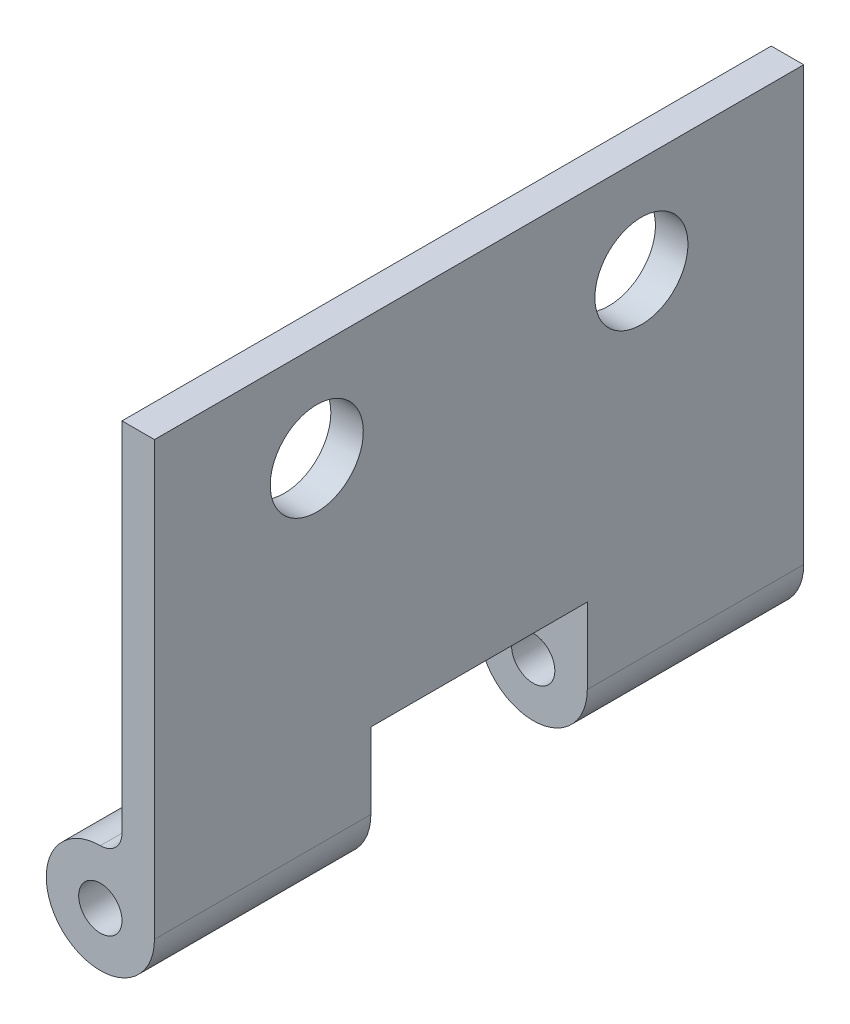
ISO-10303-21;
HEADER;
FILE_DESCRIPTION(('STEP AP214'),'2;1');
FILE_NAME('part.step','',(''),(''),'','','');
FILE_SCHEMA(('AUTOMOTIVE_DESIGN { 1 0 10303 214 1 1 1 1 }'));
ENDSEC;
DATA;
#1=APPLICATION_CONTEXT('core data for automotive mechanical design processes');
#2=APPLICATION_PROTOCOL_DEFINITION('international standard','automotive_design',2000,#1);
#3=PRODUCT_CONTEXT('',#1,'mechanical');
#4=PRODUCT('Part','Part','',(#3));
#5=PRODUCT_RELATED_PRODUCT_CATEGORY('part','',(#4));
#6=PRODUCT_DEFINITION_FORMATION('','',#4);
#7=PRODUCT_DEFINITION_CONTEXT('part definition',#1,'design');
#8=PRODUCT_DEFINITION('design','',#6,#7);
#9=PRODUCT_DEFINITION_SHAPE('','',#8);
#10=(LENGTH_UNIT() NAMED_UNIT(*) SI_UNIT(.MILLI.,.METRE.));
#11=(NAMED_UNIT(*) PLANE_ANGLE_UNIT() SI_UNIT($,.RADIAN.));
#12=(NAMED_UNIT(*) SI_UNIT($,.STERADIAN.) SOLID_ANGLE_UNIT());
#13=UNCERTAINTY_MEASURE_WITH_UNIT(LENGTH_MEASURE(1.E-05),#10,'distance_accuracy_value','');
#14=(GEOMETRIC_REPRESENTATION_CONTEXT(3) GLOBAL_UNCERTAINTY_ASSIGNED_CONTEXT((#13)) GLOBAL_UNIT_ASSIGNED_CONTEXT((#10,
#11,#12)) REPRESENTATION_CONTEXT('',''));
#15=CARTESIAN_POINT('',(0.,0.,0.));
#16=DIRECTION('',(0.,0.,1.));
#17=DIRECTION('',(1.,0.,0.));
#18=AXIS2_PLACEMENT_3D('',#15,#16,#17);
#19=CARTESIAN_POINT('',(0.,3.5,30.));
#20=DIRECTION('',(0.,0.,-1.));
#21=DIRECTION('',(-1.,0.,0.));
#22=AXIS2_PLACEMENT_3D('',#19,#20,#21);
#23=CYLINDRICAL_SURFACE('',#22,1.);
#24=DIRECTION('',(0.,0.,-1.));
#25=VECTOR('',#24,1.);
#26=CARTESIAN_POINT('',(0.999999999999999,3.5,30.));
#27=LINE('',#26,#25);
#28=CARTESIAN_POINT('',(0.999999999999999,3.5,30.));
#29=VERTEX_POINT('',#28);
#30=CARTESIAN_POINT('',(0.999999999999999,3.5,20.));
#31=VERTEX_POINT('',#30);
#32=EDGE_CURVE('E140',#29,#31,#27,.T.);
#33=ORIENTED_EDGE('',*,*,#32,.T.);
#34=CARTESIAN_POINT('',(0.,3.5,20.));
#35=DIRECTION('',(0.,0.,1.));
#36=DIRECTION('',(1.,0.,0.));
#37=AXIS2_PLACEMENT_3D('',#34,#35,#36);
#38=CIRCLE('',#37,1.);
#39=CARTESIAN_POINT('',(0.,2.5,20.));
#40=VERTEX_POINT('',#39);
#41=EDGE_CURVE('E158',#31,#40,#38,.F.);
#42=ORIENTED_EDGE('',*,*,#41,.T.);
#43=DIRECTION('',(0.,0.,-1.));
#44=VECTOR('',#43,1.);
#45=CARTESIAN_POINT('',(0.,2.5,30.));
#46=LINE('',#45,#44);
#47=CARTESIAN_POINT('',(0.,2.5,30.));
#48=VERTEX_POINT('',#47);
#49=EDGE_CURVE('E11',#48,#40,#46,.T.);
#50=ORIENTED_EDGE('',*,*,#49,.F.);
#51=CARTESIAN_POINT('',(0.,3.5,30.));
#52=DIRECTION('',(0.,0.,-1.));
#53=DIRECTION('',(-1.,0.,0.));
#54=AXIS2_PLACEMENT_3D('',#51,#52,#53);
#55=CIRCLE('',#54,1.);
#56=EDGE_CURVE('E139',#29,#48,#55,.T.);
#57=ORIENTED_EDGE('',*,*,#56,.F.);
#58=EDGE_LOOP('',(#33,#42,#50,#57));
#59=FACE_BOUND('',#58,.T.);
#60=ADVANCED_FACE('F37',(#59),#23,.F.);
#61=CARTESIAN_POINT('',(0.,0.,30.));
#62=DIRECTION('',(0.,0.,-1.));
#63=DIRECTION('',(-1.,0.,0.));
#64=AXIS2_PLACEMENT_3D('',#61,#62,#63);
#65=CYLINDRICAL_SURFACE('',#64,2.5);
#66=ORIENTED_EDGE('',*,*,#49,.T.);
#67=CARTESIAN_POINT('',(0.,0.,20.));
#68=DIRECTION('',(0.,0.,1.));
#69=DIRECTION('',(1.,0.,0.));
#70=AXIS2_PLACEMENT_3D('',#67,#68,#69);
#71=CIRCLE('',#70,2.5);
#72=CARTESIAN_POINT('',(2.5,0.,20.));
#73=VERTEX_POINT('',#72);
#74=EDGE_CURVE('E154',#40,#73,#71,.T.);
#75=ORIENTED_EDGE('',*,*,#74,.T.);
#76=DIRECTION('',(0.,0.,-1.));
#77=VECTOR('',#76,1.);
#78=CARTESIAN_POINT('',(2.5,0.,30.));
#79=LINE('',#78,#77);
#80=CARTESIAN_POINT('',(2.5,0.,30.));
#81=VERTEX_POINT('',#80);
#82=EDGE_CURVE('E145',#81,#73,#79,.T.);
#83=ORIENTED_EDGE('',*,*,#82,.F.);
#84=CARTESIAN_POINT('',(0.,0.,30.));
#85=DIRECTION('',(0.,0.,1.));
#86=DIRECTION('',(1.,0.,0.));
#87=AXIS2_PLACEMENT_3D('',#84,#85,#86);
#88=CIRCLE('',#87,2.5);
#89=EDGE_CURVE('E96',#48,#81,#88,.T.);
#90=ORIENTED_EDGE('',*,*,#89,.F.);
#91=EDGE_LOOP('',(#66,#75,#83,#90));
#92=FACE_BOUND('',#91,.T.);
#93=ADVANCED_FACE('F176',(#92),#65,.T.);
#94=CARTESIAN_POINT('',(0.,0.,30.));
#95=DIRECTION('',(0.,0.,-1.));
#96=DIRECTION('',(-1.,0.,0.));
#97=AXIS2_PLACEMENT_3D('',#94,#95,#96);
#98=CYLINDRICAL_SURFACE('',#97,0.999999999999999);
#99=CARTESIAN_POINT('',(0.,0.,20.));
#100=DIRECTION('',(0.,0.,1.));
#101=DIRECTION('',(1.,0.,0.));
#102=AXIS2_PLACEMENT_3D('',#99,#100,#101);
#103=CIRCLE('',#102,0.999999999999999);
#104=CARTESIAN_POINT('',(0.999999999999999,0.,20.));
#105=VERTEX_POINT('',#104);
#106=EDGE_CURVE('E152',#105,#105,#103,.T.);
#107=ORIENTED_EDGE('',*,*,#106,.F.);
#108=EDGE_LOOP('',(#107));
#109=FACE_BOUND('',#108,.T.);
#110=CARTESIAN_POINT('',(0.,0.,30.));
#111=DIRECTION('',(0.,0.,1.));
#112=DIRECTION('',(1.,0.,0.));
#113=AXIS2_PLACEMENT_3D('',#110,#111,#112);
#114=CIRCLE('',#113,0.999999999999999);
#115=CARTESIAN_POINT('',(0.999999999999999,0.,30.));
#116=VERTEX_POINT('',#115);
#117=EDGE_CURVE('E131',#116,#116,#114,.T.);
#118=ORIENTED_EDGE('',*,*,#117,.T.);
#119=EDGE_LOOP('',(#118));
#120=FACE_BOUND('',#119,.T.);
#121=ADVANCED_FACE('F238',(#109,#120),#98,.F.);
#122=CARTESIAN_POINT('',(0.,3.5,30.));
#123=DIRECTION('',(0.,0.,-1.));
#124=DIRECTION('',(-1.,0.,0.));
#125=AXIS2_PLACEMENT_3D('',#122,#123,#124);
#126=PLANE('',#125);
#127=ORIENTED_EDGE('',*,*,#56,.T.);
#128=ORIENTED_EDGE('',*,*,#89,.T.);
#129=DIRECTION('',(0.,1.,0.));
#130=VECTOR('',#129,1.);
#131=CARTESIAN_POINT('',(2.5,0.,30.));
#132=LINE('',#131,#130);
#133=CARTESIAN_POINT('',(2.5,20.,30.));
#134=VERTEX_POINT('',#133);
#135=EDGE_CURVE('E102',#81,#134,#132,.T.);
#136=ORIENTED_EDGE('',*,*,#135,.T.);
#137=DIRECTION('',(-1.,0.,0.));
#138=VECTOR('',#137,1.);
#139=CARTESIAN_POINT('',(1.,20.,30.));
#140=LINE('',#139,#138);
#141=CARTESIAN_POINT('',(1.,20.,30.));
#142=VERTEX_POINT('',#141);
#143=EDGE_CURVE('E107',#134,#142,#140,.T.);
#144=ORIENTED_EDGE('',*,*,#143,.T.);
#145=DIRECTION('',(0.,-1.,0.));
#146=VECTOR('',#145,1.);
#147=CARTESIAN_POINT('',(0.999999999999999,3.5,30.));
#148=LINE('',#147,#146);
#149=EDGE_CURVE('E63',#142,#29,#148,.T.);
#150=ORIENTED_EDGE('',*,*,#149,.T.);
#151=EDGE_LOOP('',(#127,#128,#136,#144,#150));
#152=FACE_BOUND('',#151,.T.);
#153=ORIENTED_EDGE('',*,*,#117,.F.);
#154=EDGE_LOOP('',(#153));
#155=FACE_BOUND('',#154,.T.);
#156=ADVANCED_FACE('F104',(#152,#155),#126,.F.);
#157=CARTESIAN_POINT('',(0.,3.5,0.));
#158=DIRECTION('',(0.,0.,-1.));
#159=DIRECTION('',(-1.,0.,0.));
#160=AXIS2_PLACEMENT_3D('',#157,#158,#159);
#161=PLANE('',#160);
#162=CARTESIAN_POINT('',(0.,3.5,0.));
#163=DIRECTION('',(0.,0.,-1.));
#164=DIRECTION('',(-1.,0.,0.));
#165=AXIS2_PLACEMENT_3D('',#162,#163,#164);
#166=CIRCLE('',#165,1.);
#167=CARTESIAN_POINT('',(0.999999999999999,3.5,0.));
#168=VERTEX_POINT('',#167);
#169=CARTESIAN_POINT('',(0.,2.5,0.));
#170=VERTEX_POINT('',#169);
#171=EDGE_CURVE('E128',#168,#170,#166,.T.);
#172=ORIENTED_EDGE('',*,*,#171,.F.);
#173=DIRECTION('',(0.,-1.,0.));
#174=VECTOR('',#173,1.);
#175=CARTESIAN_POINT('',(0.999999999999999,3.5,0.));
#176=LINE('',#175,#174);
#177=CARTESIAN_POINT('',(1.,20.,0.));
#178=VERTEX_POINT('',#177);
#179=EDGE_CURVE('E137',#178,#168,#176,.T.);
#180=ORIENTED_EDGE('',*,*,#179,.F.);
#181=DIRECTION('',(-1.,0.,0.));
#182=VECTOR('',#181,1.);
#183=CARTESIAN_POINT('',(1.,20.,0.));
#184=LINE('',#183,#182);
#185=CARTESIAN_POINT('',(2.5,20.,0.));
#186=VERTEX_POINT('',#185);
#187=EDGE_CURVE('E135',#186,#178,#184,.T.);
#188=ORIENTED_EDGE('',*,*,#187,.F.);
#189=DIRECTION('',(0.,1.,0.));
#190=VECTOR('',#189,1.);
#191=CARTESIAN_POINT('',(2.5,0.,0.));
#192=LINE('',#191,#190);
#193=CARTESIAN_POINT('',(2.5,0.,0.));
#194=VERTEX_POINT('',#193);
#195=EDGE_CURVE('E116',#194,#186,#192,.T.);
#196=ORIENTED_EDGE('',*,*,#195,.F.);
#197=CARTESIAN_POINT('',(0.,0.,0.));
#198=DIRECTION('',(0.,0.,1.));
#199=DIRECTION('',(1.,0.,0.));
#200=AXIS2_PLACEMENT_3D('',#197,#198,#199);
#201=CIRCLE('',#200,2.5);
#202=EDGE_CURVE('E130',#170,#194,#201,.T.);
#203=ORIENTED_EDGE('',*,*,#202,.F.);
#204=EDGE_LOOP('',(#172,#180,#188,#196,#203));
#205=FACE_BOUND('',#204,.T.);
#206=CARTESIAN_POINT('',(0.,0.,0.));
#207=DIRECTION('',(0.,0.,1.));
#208=DIRECTION('',(1.,0.,0.));
#209=AXIS2_PLACEMENT_3D('',#206,#207,#208);
#210=CIRCLE('',#209,0.999999999999999);
#211=CARTESIAN_POINT('',(0.999999999999999,0.,0.));
#212=VERTEX_POINT('',#211);
#213=EDGE_CURVE('E162',#212,#212,#210,.T.);
#214=ORIENTED_EDGE('',*,*,#213,.T.);
#215=EDGE_LOOP('',(#214));
#216=FACE_BOUND('',#215,.T.);
#217=ADVANCED_FACE('F228',(#205,#216),#161,.T.);
#218=CARTESIAN_POINT('',(0.,2.5,9.99999999999999));
#219=VERTEX_POINT('',#218);
#220=EDGE_CURVE('E46',#219,#170,#46,.T.);
#221=ORIENTED_EDGE('',*,*,#220,.F.);
#222=CARTESIAN_POINT('',(0.,3.5,9.99999999999999));
#223=DIRECTION('',(0.,0.,-1.));
#224=DIRECTION('',(-1.,0.,0.));
#225=AXIS2_PLACEMENT_3D('',#222,#223,#224);
#226=CIRCLE('',#225,1.);
#227=CARTESIAN_POINT('',(0.999999999999999,3.5,10.));
#228=VERTEX_POINT('',#227);
#229=EDGE_CURVE('E155',#219,#228,#226,.F.);
#230=ORIENTED_EDGE('',*,*,#229,.T.);
#231=EDGE_CURVE('E88',#228,#168,#27,.T.);
#232=ORIENTED_EDGE('',*,*,#231,.T.);
#233=ORIENTED_EDGE('',*,*,#171,.T.);
#234=EDGE_LOOP('',(#221,#230,#232,#233));
#235=FACE_BOUND('',#234,.T.);
#236=ADVANCED_FACE('F39',(#235),#23,.F.);
#237=CARTESIAN_POINT('',(2.5,0.,10.));
#238=VERTEX_POINT('',#237);
#239=EDGE_CURVE('E119',#238,#194,#79,.T.);
#240=ORIENTED_EDGE('',*,*,#239,.F.);
#241=CARTESIAN_POINT('',(0.,0.,9.99999999999999));
#242=DIRECTION('',(0.,0.,-1.));
#243=DIRECTION('',(-1.,0.,0.));
#244=AXIS2_PLACEMENT_3D('',#241,#242,#243);
#245=CIRCLE('',#244,2.5);
#246=EDGE_CURVE('E150',#238,#219,#245,.T.);
#247=ORIENTED_EDGE('',*,*,#246,.T.);
#248=ORIENTED_EDGE('',*,*,#220,.T.);
#249=ORIENTED_EDGE('',*,*,#202,.T.);
#250=EDGE_LOOP('',(#240,#247,#248,#249));
#251=FACE_BOUND('',#250,.T.);
#252=ADVANCED_FACE('F225',(#251),#65,.T.);
#253=CARTESIAN_POINT('',(2.5,0.,30.));
#254=DIRECTION('',(-1.,0.,0.));
#255=DIRECTION('',(0.,-1.,0.));
#256=AXIS2_PLACEMENT_3D('',#253,#254,#255);
#257=PLANE('',#256);
#258=CARTESIAN_POINT('',(2.5,15.5,7.5));
#259=DIRECTION('',(-1.,0.,0.));
#260=DIRECTION('',(0.,-1.,0.));
#261=AXIS2_PLACEMENT_3D('',#258,#259,#260);
#262=CIRCLE('',#261,2.15);
#263=CARTESIAN_POINT('',(2.5,13.35,7.5));
#264=VERTEX_POINT('',#263);
#265=EDGE_CURVE('E151',#264,#264,#262,.T.);
#266=ORIENTED_EDGE('',*,*,#265,.T.);
#267=EDGE_LOOP('',(#266));
#268=FACE_BOUND('',#267,.T.);
#269=CARTESIAN_POINT('',(2.5,15.5,22.5));
#270=DIRECTION('',(-1.,0.,0.));
#271=DIRECTION('',(0.,-1.,0.));
#272=AXIS2_PLACEMENT_3D('',#269,#270,#271);
#273=CIRCLE('',#272,2.15);
#274=CARTESIAN_POINT('',(2.5,13.35,22.5));
#275=VERTEX_POINT('',#274);
#276=EDGE_CURVE('E210',#275,#275,#273,.T.);
#277=ORIENTED_EDGE('',*,*,#276,.T.);
#278=EDGE_LOOP('',(#277));
#279=FACE_BOUND('',#278,.T.);
#280=ORIENTED_EDGE('',*,*,#82,.T.);
#281=DIRECTION('',(0.,1.,0.));
#282=VECTOR('',#281,1.);
#283=CARTESIAN_POINT('',(2.5,-3.5,20.));
#284=LINE('',#283,#282);
#285=CARTESIAN_POINT('',(2.5,3.5,20.));
#286=VERTEX_POINT('',#285);
#287=EDGE_CURVE('E196',#73,#286,#284,.T.);
#288=ORIENTED_EDGE('',*,*,#287,.T.);
#289=DIRECTION('',(0.,0.,-1.));
#290=VECTOR('',#289,1.);
#291=CARTESIAN_POINT('',(2.5,3.5,10.));
#292=LINE('',#291,#290);
#293=CARTESIAN_POINT('',(2.5,3.5,10.));
#294=VERTEX_POINT('',#293);
#295=EDGE_CURVE('E202',#286,#294,#292,.T.);
#296=ORIENTED_EDGE('',*,*,#295,.T.);
#297=DIRECTION('',(0.,-1.,0.));
#298=VECTOR('',#297,1.);
#299=CARTESIAN_POINT('',(2.5,-3.5,10.));
#300=LINE('',#299,#298);
#301=EDGE_CURVE('E199',#294,#238,#300,.T.);
#302=ORIENTED_EDGE('',*,*,#301,.T.);
#303=ORIENTED_EDGE('',*,*,#239,.T.);
#304=ORIENTED_EDGE('',*,*,#195,.T.);
#305=DIRECTION('',(0.,0.,-1.));
#306=VECTOR('',#305,1.);
#307=CARTESIAN_POINT('',(2.5,20.,30.));
#308=LINE('',#307,#306);
#309=EDGE_CURVE('E113',#134,#186,#308,.T.);
#310=ORIENTED_EDGE('',*,*,#309,.F.);
#311=ORIENTED_EDGE('',*,*,#135,.F.);
#312=EDGE_LOOP('',(#280,#288,#296,#302,#303,#304,#310,#311));
#313=FACE_BOUND('',#312,.T.);
#314=ADVANCED_FACE('F114',(#268,#279,#313),#257,.F.);
#315=CARTESIAN_POINT('',(1.,20.,30.));
#316=DIRECTION('',(0.,-1.,0.));
#317=DIRECTION('',(0.,0.,-1.));
#318=AXIS2_PLACEMENT_3D('',#315,#316,#317);
#319=PLANE('',#318);
#320=ORIENTED_EDGE('',*,*,#187,.T.);
#321=DIRECTION('',(0.,0.,-1.));
#322=VECTOR('',#321,1.);
#323=CARTESIAN_POINT('',(1.,20.,30.));
#324=LINE('',#323,#322);
#325=EDGE_CURVE('E120',#142,#178,#324,.T.);
#326=ORIENTED_EDGE('',*,*,#325,.F.);
#327=ORIENTED_EDGE('',*,*,#143,.F.);
#328=ORIENTED_EDGE('',*,*,#309,.T.);
#329=EDGE_LOOP('',(#320,#326,#327,#328));
#330=FACE_BOUND('',#329,.T.);
#331=ADVANCED_FACE('F122',(#330),#319,.F.);
#332=CARTESIAN_POINT('',(0.999999999999999,3.5,30.));
#333=DIRECTION('',(1.,0.,0.));
#334=DIRECTION('',(0.,1.,0.));
#335=AXIS2_PLACEMENT_3D('',#332,#333,#334);
#336=PLANE('',#335);
#337=CARTESIAN_POINT('',(1.,15.5,7.5));
#338=DIRECTION('',(1.,0.,0.));
#339=DIRECTION('',(0.,1.,0.));
#340=AXIS2_PLACEMENT_3D('',#337,#338,#339);
#341=CIRCLE('',#340,2.15);
#342=CARTESIAN_POINT('',(1.,17.65,7.5));
#343=VERTEX_POINT('',#342);
#344=EDGE_CURVE('E41',#343,#343,#341,.T.);
#345=ORIENTED_EDGE('',*,*,#344,.T.);
#346=EDGE_LOOP('',(#345));
#347=FACE_BOUND('',#346,.T.);
#348=CARTESIAN_POINT('',(1.,15.5,22.5));
#349=DIRECTION('',(1.,0.,0.));
#350=DIRECTION('',(0.,1.,0.));
#351=AXIS2_PLACEMENT_3D('',#348,#349,#350);
#352=CIRCLE('',#351,2.15);
#353=CARTESIAN_POINT('',(1.,17.65,22.5));
#354=VERTEX_POINT('',#353);
#355=EDGE_CURVE('E156',#354,#354,#352,.T.);
#356=ORIENTED_EDGE('',*,*,#355,.T.);
#357=EDGE_LOOP('',(#356));
#358=FACE_BOUND('',#357,.T.);
#359=ORIENTED_EDGE('',*,*,#179,.T.);
#360=ORIENTED_EDGE('',*,*,#231,.F.);
#361=EDGE_CURVE('E143',#31,#228,#27,.T.);
#362=ORIENTED_EDGE('',*,*,#361,.F.);
#363=ORIENTED_EDGE('',*,*,#32,.F.);
#364=ORIENTED_EDGE('',*,*,#149,.F.);
#365=ORIENTED_EDGE('',*,*,#325,.T.);
#366=EDGE_LOOP('',(#359,#360,#362,#363,#364,#365));
#367=FACE_BOUND('',#366,.T.);
#368=ADVANCED_FACE('F219',(#347,#358,#367),#336,.F.);
#369=CARTESIAN_POINT('',(0.,0.,9.99999999999999));
#370=DIRECTION('',(0.,0.,-1.));
#371=DIRECTION('',(-1.,0.,0.));
#372=AXIS2_PLACEMENT_3D('',#369,#370,#371);
#373=CIRCLE('',#372,0.999999999999999);
#374=CARTESIAN_POINT('',(-0.999999999999999,0.,9.99999999999999));
#375=VERTEX_POINT('',#374);
#376=EDGE_CURVE('E147',#375,#375,#373,.T.);
#377=ORIENTED_EDGE('',*,*,#376,.F.);
#378=EDGE_LOOP('',(#377));
#379=FACE_BOUND('',#378,.T.);
#380=ORIENTED_EDGE('',*,*,#213,.F.);
#381=EDGE_LOOP('',(#380));
#382=FACE_BOUND('',#381,.T.);
#383=ADVANCED_FACE('F234',(#379,#382),#98,.F.);
#384=CARTESIAN_POINT('',(2.5,3.5,10.));
#385=DIRECTION('',(0.,1.,0.));
#386=DIRECTION('',(-1.,0.,0.));
#387=AXIS2_PLACEMENT_3D('',#384,#385,#386);
#388=PLANE('',#387);
#389=DIRECTION('',(-1.,0.,0.));
#390=VECTOR('',#389,1.);
#391=CARTESIAN_POINT('',(2.5,3.5,10.));
#392=LINE('',#391,#390);
#393=EDGE_CURVE('E198',#294,#228,#392,.T.);
#394=ORIENTED_EDGE('',*,*,#393,.F.);
#395=ORIENTED_EDGE('',*,*,#295,.F.);
#396=DIRECTION('',(-1.,0.,0.));
#397=VECTOR('',#396,1.);
#398=CARTESIAN_POINT('',(2.5,3.5,20.));
#399=LINE('',#398,#397);
#400=EDGE_CURVE('E54',#286,#31,#399,.T.);
#401=ORIENTED_EDGE('',*,*,#400,.T.);
#402=ORIENTED_EDGE('',*,*,#361,.T.);
#403=EDGE_LOOP('',(#394,#395,#401,#402));
#404=FACE_BOUND('',#403,.T.);
#405=ADVANCED_FACE('F203',(#404),#388,.F.);
#406=CARTESIAN_POINT('',(2.5,-3.5,20.));
#407=DIRECTION('',(0.,0.,1.));
#408=DIRECTION('',(1.,0.,0.));
#409=AXIS2_PLACEMENT_3D('',#406,#407,#408);
#410=PLANE('',#409);
#411=ORIENTED_EDGE('',*,*,#106,.T.);
#412=EDGE_LOOP('',(#411));
#413=FACE_BOUND('',#412,.T.);
#414=ORIENTED_EDGE('',*,*,#400,.F.);
#415=ORIENTED_EDGE('',*,*,#287,.F.);
#416=ORIENTED_EDGE('',*,*,#74,.F.);
#417=ORIENTED_EDGE('',*,*,#41,.F.);
#418=EDGE_LOOP('',(#414,#415,#416,#417));
#419=FACE_BOUND('',#418,.T.);
#420=ADVANCED_FACE('F194',(#413,#419),#410,.F.);
#421=CARTESIAN_POINT('',(2.5,-3.5,10.));
#422=DIRECTION('',(0.,0.,-1.));
#423=DIRECTION('',(-1.,0.,0.));
#424=AXIS2_PLACEMENT_3D('',#421,#422,#423);
#425=PLANE('',#424);
#426=ORIENTED_EDGE('',*,*,#376,.T.);
#427=EDGE_LOOP('',(#426));
#428=FACE_BOUND('',#427,.T.);
#429=ORIENTED_EDGE('',*,*,#246,.F.);
#430=ORIENTED_EDGE('',*,*,#301,.F.);
#431=ORIENTED_EDGE('',*,*,#393,.T.);
#432=ORIENTED_EDGE('',*,*,#229,.F.);
#433=EDGE_LOOP('',(#429,#430,#431,#432));
#434=FACE_BOUND('',#433,.T.);
#435=ADVANCED_FACE('F222',(#428,#434),#425,.F.);
#436=CARTESIAN_POINT('',(2.5,15.5,22.5));
#437=DIRECTION('',(-1.,0.,0.));
#438=DIRECTION('',(0.,-1.,0.));
#439=AXIS2_PLACEMENT_3D('',#436,#437,#438);
#440=CYLINDRICAL_SURFACE('',#439,2.15);
#441=ORIENTED_EDGE('',*,*,#276,.F.);
#442=EDGE_LOOP('',(#441));
#443=FACE_BOUND('',#442,.T.);
#444=ORIENTED_EDGE('',*,*,#355,.F.);
#445=EDGE_LOOP('',(#444));
#446=FACE_BOUND('',#445,.T.);
#447=ADVANCED_FACE('F313',(#443,#446),#440,.F.);
#448=CARTESIAN_POINT('',(2.5,15.5,7.5));
#449=DIRECTION('',(-1.,0.,0.));
#450=DIRECTION('',(0.,-1.,0.));
#451=AXIS2_PLACEMENT_3D('',#448,#449,#450);
#452=CYLINDRICAL_SURFACE('',#451,2.15);
#453=ORIENTED_EDGE('',*,*,#265,.F.);
#454=EDGE_LOOP('',(#453));
#455=FACE_BOUND('',#454,.T.);
#456=ORIENTED_EDGE('',*,*,#344,.F.);
#457=EDGE_LOOP('',(#456));
#458=FACE_BOUND('',#457,.T.);
#459=ADVANCED_FACE('F321',(#455,#458),#452,.F.);
#460=CLOSED_SHELL('',(#60,#93,#121,#156,#217,#236,#252,#314,#331,#368,#383,#405,#420,#435,#447,#459));
#461=MANIFOLD_SOLID_BREP('B2',#460);
#462=ADVANCED_BREP_SHAPE_REPRESENTATION('',(#18,#461),#14);
#463=SHAPE_DEFINITION_REPRESENTATION(#9,#462);
ENDSEC;
END-ISO-10303-21;
